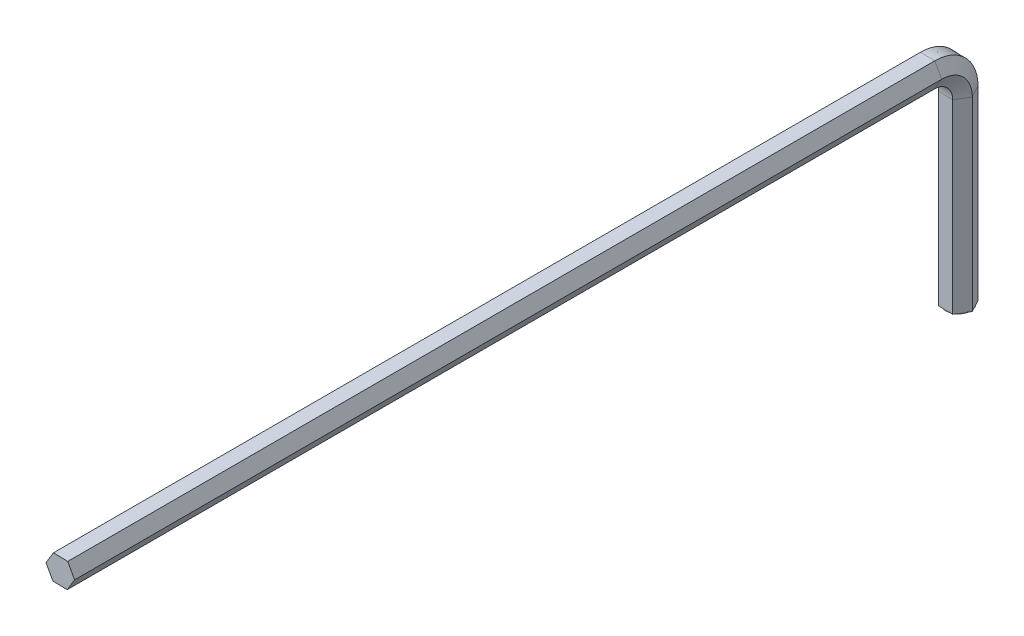
ISO-10303-21;
HEADER;
FILE_DESCRIPTION(('STEP AP214'),'2;1');
FILE_NAME('part.step','',(''),(''),'','','');
FILE_SCHEMA(('AUTOMOTIVE_DESIGN { 1 0 10303 214 1 1 1 1 }'));
ENDSEC;
DATA;
#1=APPLICATION_CONTEXT('core data for automotive mechanical design processes');
#2=APPLICATION_PROTOCOL_DEFINITION('international standard','automotive_design',2000,#1);
#3=PRODUCT_CONTEXT('',#1,'mechanical');
#4=PRODUCT('Part','Part','',(#3));
#5=PRODUCT_RELATED_PRODUCT_CATEGORY('part','',(#4));
#6=PRODUCT_DEFINITION_FORMATION('','',#4);
#7=PRODUCT_DEFINITION_CONTEXT('part definition',#1,'design');
#8=PRODUCT_DEFINITION('design','',#6,#7);
#9=PRODUCT_DEFINITION_SHAPE('','',#8);
#10=(LENGTH_UNIT() NAMED_UNIT(*) SI_UNIT(.MILLI.,.METRE.));
#11=(NAMED_UNIT(*) PLANE_ANGLE_UNIT() SI_UNIT($,.RADIAN.));
#12=(NAMED_UNIT(*) SI_UNIT($,.STERADIAN.) SOLID_ANGLE_UNIT());
#13=UNCERTAINTY_MEASURE_WITH_UNIT(LENGTH_MEASURE(1.E-05),#10,'distance_accuracy_value','');
#14=(GEOMETRIC_REPRESENTATION_CONTEXT(3) GLOBAL_UNCERTAINTY_ASSIGNED_CONTEXT((#13)) GLOBAL_UNIT_ASSIGNED_CONTEXT((#10,
#11,#12)) REPRESENTATION_CONTEXT('',''));
#15=CARTESIAN_POINT('',(0.,0.,0.));
#16=DIRECTION('',(0.,0.,1.));
#17=DIRECTION('',(1.,0.,0.));
#18=AXIS2_PLACEMENT_3D('',#15,#16,#17);
#19=CARTESIAN_POINT('',(0.,0.,0.));
#20=DIRECTION('',(0.,1.,0.));
#21=DIRECTION('',(0.,0.,1.));
#22=AXIS2_PLACEMENT_3D('',#19,#20,#21);
#23=PLANE('',#22);
#24=CARTESIAN_POINT('',(0.,0.,0.));
#25=DIRECTION('',(0.,-1.,0.));
#26=DIRECTION('',(0.,0.,-1.));
#27=AXIS2_PLACEMENT_3D('',#24,#25,#26);
#28=CIRCLE('',#27,2.);
#29=CARTESIAN_POINT('',(0.0427016764946208,0.,-1.9995440897426));
#30=VERTEX_POINT('',#29);
#31=CARTESIAN_POINT('',(1.75300681595143,0.,-0.962791308242771));
#32=VERTEX_POINT('',#31);
#33=EDGE_CURVE('E55',#30,#32,#28,.T.);
#34=ORIENTED_EDGE('',*,*,#33,.F.);
#35=DIRECTION('',(-0.999772044871298,0.,-0.0213508382473104));
#36=VECTOR('',#35,1.);
#37=CARTESIAN_POINT('',(1.19713899496403,0.,-1.97489026532358));
#38=LINE('',#37,#36);
#39=CARTESIAN_POINT('',(1.19713899496403,0.,-1.97489026532358));
#40=VERTEX_POINT('',#39);
#41=EDGE_CURVE('E152',#40,#30,#38,.T.);
#42=ORIENTED_EDGE('',*,*,#41,.F.);
#43=DIRECTION('',(-0.481395654121386,0.,-0.876503407975715));
#44=VECTOR('',#43,1.);
#45=CARTESIAN_POINT('',(2.30887463693882,0.,0.0493076488380349));
#46=LINE('',#45,#44);
#47=EDGE_CURVE('E178',#32,#40,#46,.T.);
#48=ORIENTED_EDGE('',*,*,#47,.F.);
#49=EDGE_LOOP('',(#34,#42,#48));
#50=FACE_BOUND('',#49,.T.);
#51=ADVANCED_FACE('F41',(#50),#23,.F.);
#52=CARTESIAN_POINT('',(1.71030513945681,0.,1.03675278149982));
#53=VERTEX_POINT('',#52);
#54=EDGE_CURVE('E11',#32,#53,#28,.T.);
#55=ORIENTED_EDGE('',*,*,#54,.F.);
#56=CARTESIAN_POINT('',(2.30887463693882,0.,0.0493076488380349));
#57=VERTEX_POINT('',#56);
#58=EDGE_CURVE('E171',#57,#32,#46,.T.);
#59=ORIENTED_EDGE('',*,*,#58,.F.);
#60=DIRECTION('',(0.518376390749912,0.,-0.855152569728405));
#61=VECTOR('',#60,1.);
#62=CARTESIAN_POINT('',(1.11173564197479,0.,2.02419791416162));
#63=LINE('',#62,#61);
#64=EDGE_CURVE('E238',#53,#57,#63,.T.);
#65=ORIENTED_EDGE('',*,*,#64,.F.);
#66=EDGE_LOOP('',(#55,#59,#65));
#67=FACE_BOUND('',#66,.T.);
#68=ADVANCED_FACE('F351',(#67),#23,.F.);
#69=CARTESIAN_POINT('',(-0.0427016764946206,0.,1.9995440897426));
#70=VERTEX_POINT('',#69);
#71=EDGE_CURVE('E49',#53,#70,#28,.T.);
#72=ORIENTED_EDGE('',*,*,#71,.F.);
#73=CARTESIAN_POINT('',(1.11173564197479,0.,2.02419791416162));
#74=VERTEX_POINT('',#73);
#75=EDGE_CURVE('E256',#74,#53,#63,.T.);
#76=ORIENTED_EDGE('',*,*,#75,.F.);
#77=DIRECTION('',(0.999772044871298,0.,0.0213508382473102));
#78=VECTOR('',#77,1.);
#79=CARTESIAN_POINT('',(-1.19713899496403,0.,1.97489026532358));
#80=LINE('',#79,#78);
#81=EDGE_CURVE('E218',#70,#74,#80,.T.);
#82=ORIENTED_EDGE('',*,*,#81,.F.);
#83=EDGE_LOOP('',(#72,#76,#82));
#84=FACE_BOUND('',#83,.T.);
#85=ADVANCED_FACE('F348',(#84),#23,.F.);
#86=CARTESIAN_POINT('',(-1.75300681595143,0.,0.962791308242776));
#87=VERTEX_POINT('',#86);
#88=EDGE_CURVE('E68',#70,#87,#28,.T.);
#89=ORIENTED_EDGE('',*,*,#88,.F.);
#90=CARTESIAN_POINT('',(-1.19713899496403,0.,1.97489026532358));
#91=VERTEX_POINT('',#90);
#92=EDGE_CURVE('E240',#91,#70,#80,.T.);
#93=ORIENTED_EDGE('',*,*,#92,.F.);
#94=DIRECTION('',(0.481395654121388,0.,0.876503407975714));
#95=VECTOR('',#94,1.);
#96=CARTESIAN_POINT('',(-2.30887463693883,0.,-0.0493076488380324));
#97=LINE('',#96,#95);
#98=EDGE_CURVE('E183',#87,#91,#97,.T.);
#99=ORIENTED_EDGE('',*,*,#98,.F.);
#100=EDGE_LOOP('',(#89,#93,#99));
#101=FACE_BOUND('',#100,.T.);
#102=ADVANCED_FACE('F377',(#101),#23,.F.);
#103=CARTESIAN_POINT('',(-1.71030513945681,0.,-1.03675278149982));
#104=VERTEX_POINT('',#103);
#105=EDGE_CURVE('E56',#87,#104,#28,.T.);
#106=ORIENTED_EDGE('',*,*,#105,.F.);
#107=CARTESIAN_POINT('',(-2.30887463693883,0.,-0.0493076488380324));
#108=VERTEX_POINT('',#107);
#109=EDGE_CURVE('E216',#108,#87,#97,.T.);
#110=ORIENTED_EDGE('',*,*,#109,.F.);
#111=DIRECTION('',(-0.518376390749912,0.,0.855152569728405));
#112=VECTOR('',#111,1.);
#113=CARTESIAN_POINT('',(-1.11173564197479,0.,-2.02419791416161));
#114=LINE('',#113,#112);
#115=EDGE_CURVE('E187',#104,#108,#114,.T.);
#116=ORIENTED_EDGE('',*,*,#115,.F.);
#117=EDGE_LOOP('',(#106,#110,#116));
#118=FACE_BOUND('',#117,.T.);
#119=ADVANCED_FACE('F373',(#118),#23,.F.);
#120=EDGE_CURVE('E168',#104,#30,#28,.T.);
#121=ORIENTED_EDGE('',*,*,#120,.F.);
#122=CARTESIAN_POINT('',(-1.11173564197479,0.,-2.02419791416161));
#123=VERTEX_POINT('',#122);
#124=EDGE_CURVE('E175',#123,#104,#114,.T.);
#125=ORIENTED_EDGE('',*,*,#124,.F.);
#126=EDGE_CURVE('E157',#30,#123,#38,.T.);
#127=ORIENTED_EDGE('',*,*,#126,.F.);
#128=EDGE_LOOP('',(#121,#125,#127));
#129=FACE_BOUND('',#128,.T.);
#130=ADVANCED_FACE('F43',(#129),#23,.F.);
#131=CARTESIAN_POINT('',(0.,35.,145.));
#132=DIRECTION('',(0.,0.,1.));
#133=DIRECTION('',(0.,-1.,0.));
#134=AXIS2_PLACEMENT_3D('',#131,#132,#133);
#135=PLANE('',#134);
#136=DIRECTION('',(-0.518376390749912,-0.855152569728405,0.));
#137=VECTOR('',#136,1.);
#138=CARTESIAN_POINT('',(-1.11173564197479,37.0241979141616,145.));
#139=LINE('',#138,#137);
#140=CARTESIAN_POINT('',(-1.11173564197479,37.0241979141616,145.));
#141=VERTEX_POINT('',#140);
#142=CARTESIAN_POINT('',(-2.30887463693883,35.049307648838,145.));
#143=VERTEX_POINT('',#142);
#144=EDGE_CURVE('E206',#141,#143,#139,.T.);
#145=ORIENTED_EDGE('',*,*,#144,.T.);
#146=DIRECTION('',(0.481395654121388,-0.876503407975714,0.));
#147=VECTOR('',#146,1.);
#148=CARTESIAN_POINT('',(-2.30887463693883,35.049307648838,145.));
#149=LINE('',#148,#147);
#150=CARTESIAN_POINT('',(-1.19713899496403,33.0251097346764,145.));
#151=VERTEX_POINT('',#150);
#152=EDGE_CURVE('E215',#143,#151,#149,.T.);
#153=ORIENTED_EDGE('',*,*,#152,.T.);
#154=DIRECTION('',(0.999772044871298,-0.0213508382473102,0.));
#155=VECTOR('',#154,1.);
#156=CARTESIAN_POINT('',(-1.19713899496403,33.0251097346764,145.));
#157=LINE('',#156,#155);
#158=CARTESIAN_POINT('',(1.11173564197479,32.9758020858384,145.));
#159=VERTEX_POINT('',#158);
#160=EDGE_CURVE('E237',#151,#159,#157,.T.);
#161=ORIENTED_EDGE('',*,*,#160,.T.);
#162=DIRECTION('',(0.518376390749912,0.855152569728405,0.));
#163=VECTOR('',#162,1.);
#164=CARTESIAN_POINT('',(1.11173564197479,32.9758020858384,145.));
#165=LINE('',#164,#163);
#166=CARTESIAN_POINT('',(2.30887463693882,34.950692351162,145.));
#167=VERTEX_POINT('',#166);
#168=EDGE_CURVE('E260',#159,#167,#165,.T.);
#169=ORIENTED_EDGE('',*,*,#168,.T.);
#170=DIRECTION('',(-0.481395654121386,0.876503407975715,0.));
#171=VECTOR('',#170,1.);
#172=CARTESIAN_POINT('',(2.30887463693882,34.950692351162,145.));
#173=LINE('',#172,#171);
#174=CARTESIAN_POINT('',(1.19713899496403,36.9748902653236,145.));
#175=VERTEX_POINT('',#174);
#176=EDGE_CURVE('E280',#167,#175,#173,.T.);
#177=ORIENTED_EDGE('',*,*,#176,.T.);
#178=DIRECTION('',(-0.999772044871298,0.0213508382473104,0.));
#179=VECTOR('',#178,1.);
#180=CARTESIAN_POINT('',(1.19713899496403,36.9748902653236,145.));
#181=LINE('',#180,#179);
#182=EDGE_CURVE('E44',#175,#141,#181,.T.);
#183=ORIENTED_EDGE('',*,*,#182,.T.);
#184=EDGE_LOOP('',(#145,#153,#161,#169,#177,#183));
#185=FACE_BOUND('',#184,.T.);
#186=ADVANCED_FACE('F317',(#185),#135,.T.);
#187=CARTESIAN_POINT('',(-1.11173564197479,0.,-2.02419791416161));
#188=DIRECTION('',(-0.855152569728405,0.,-0.518376390749912));
#189=DIRECTION('',(-0.518376390749912,0.,0.855152569728405));
#190=AXIS2_PLACEMENT_3D('',#187,#188,#189);
#191=PLANE('',#190);
#192=DIRECTION('',(0.,1.,0.));
#193=VECTOR('',#192,1.);
#194=CARTESIAN_POINT('',(-2.30887463693883,0.,-0.0493076488380324));
#195=LINE('',#194,#193);
#196=CARTESIAN_POINT('',(-2.30887463693883,30.,-0.0493076488380324));
#197=VERTEX_POINT('',#196);
#198=EDGE_CURVE('E188',#108,#197,#195,.T.);
#199=ORIENTED_EDGE('',*,*,#198,.T.);
#200=DIRECTION('',(-0.518376390749912,0.,0.855152569728405));
#201=VECTOR('',#200,1.);
#202=CARTESIAN_POINT('',(-1.11173564197479,30.,-2.02419791416161));
#203=LINE('',#202,#201);
#204=CARTESIAN_POINT('',(-1.11173564197479,30.,-2.02419791416161));
#205=VERTEX_POINT('',#204);
#206=EDGE_CURVE('E190',#205,#197,#203,.T.);
#207=ORIENTED_EDGE('',*,*,#206,.F.);
#208=DIRECTION('',(0.,1.,0.));
#209=VECTOR('',#208,1.);
#210=CARTESIAN_POINT('',(-1.11173564197479,0.,-2.02419791416161));
#211=LINE('',#210,#209);
#212=EDGE_CURVE('E167',#123,#205,#211,.T.);
#213=ORIENTED_EDGE('',*,*,#212,.F.);
#214=ORIENTED_EDGE('',*,*,#124,.T.);
#215=ORIENTED_EDGE('',*,*,#115,.T.);
#216=EDGE_LOOP('',(#199,#207,#213,#214,#215));
#217=FACE_BOUND('',#216,.T.);
#218=ADVANCED_FACE('F304',(#217),#191,.T.);
#219=CARTESIAN_POINT('',(-2.30887463693883,0.,-0.0493076488380324));
#220=DIRECTION('',(-0.876503407975714,0.,0.481395654121388));
#221=DIRECTION('',(0.481395654121388,0.,0.876503407975714));
#222=AXIS2_PLACEMENT_3D('',#219,#220,#221);
#223=PLANE('',#222);
#224=DIRECTION('',(0.,1.,0.));
#225=VECTOR('',#224,1.);
#226=CARTESIAN_POINT('',(-1.19713899496403,0.,1.97489026532358));
#227=LINE('',#226,#225);
#228=CARTESIAN_POINT('',(-1.19713899496403,30.,1.97489026532358));
#229=VERTEX_POINT('',#228);
#230=EDGE_CURVE('E225',#91,#229,#227,.T.);
#231=ORIENTED_EDGE('',*,*,#230,.T.);
#232=DIRECTION('',(0.481395654121388,0.,0.876503407975714));
#233=VECTOR('',#232,1.);
#234=CARTESIAN_POINT('',(-2.30887463693883,30.,-0.0493076488380324));
#235=LINE('',#234,#233);
#236=EDGE_CURVE('E191',#197,#229,#235,.T.);
#237=ORIENTED_EDGE('',*,*,#236,.F.);
#238=ORIENTED_EDGE('',*,*,#198,.F.);
#239=ORIENTED_EDGE('',*,*,#109,.T.);
#240=ORIENTED_EDGE('',*,*,#98,.T.);
#241=EDGE_LOOP('',(#231,#237,#238,#239,#240));
#242=FACE_BOUND('',#241,.T.);
#243=ADVANCED_FACE('F306',(#242),#223,.T.);
#244=CARTESIAN_POINT('',(-1.19713899496403,0.,1.97489026532358));
#245=DIRECTION('',(-0.0213508382473102,0.,0.999772044871298));
#246=DIRECTION('',(0.999772044871298,0.,0.0213508382473102));
#247=AXIS2_PLACEMENT_3D('',#244,#245,#246);
#248=PLANE('',#247);
#249=DIRECTION('',(0.,1.,0.));
#250=VECTOR('',#249,1.);
#251=CARTESIAN_POINT('',(1.11173564197479,0.,2.02419791416162));
#252=LINE('',#251,#250);
#253=CARTESIAN_POINT('',(1.11173564197479,30.,2.02419791416162));
#254=VERTEX_POINT('',#253);
#255=EDGE_CURVE('E244',#74,#254,#252,.T.);
#256=ORIENTED_EDGE('',*,*,#255,.T.);
#257=DIRECTION('',(0.999772044871298,0.,0.0213508382473102));
#258=VECTOR('',#257,1.);
#259=CARTESIAN_POINT('',(-1.19713899496403,30.,1.97489026532358));
#260=LINE('',#259,#258);
#261=EDGE_CURVE('E223',#229,#254,#260,.T.);
#262=ORIENTED_EDGE('',*,*,#261,.F.);
#263=ORIENTED_EDGE('',*,*,#230,.F.);
#264=ORIENTED_EDGE('',*,*,#92,.T.);
#265=ORIENTED_EDGE('',*,*,#81,.T.);
#266=EDGE_LOOP('',(#256,#262,#263,#264,#265));
#267=FACE_BOUND('',#266,.T.);
#268=ADVANCED_FACE('F347',(#267),#248,.T.);
#269=CARTESIAN_POINT('',(1.11173564197479,0.,2.02419791416162));
#270=DIRECTION('',(0.855152569728405,0.,0.518376390749912));
#271=DIRECTION('',(0.518376390749912,0.,-0.855152569728405));
#272=AXIS2_PLACEMENT_3D('',#269,#270,#271);
#273=PLANE('',#272);
#274=DIRECTION('',(0.,1.,0.));
#275=VECTOR('',#274,1.);
#276=CARTESIAN_POINT('',(2.30887463693882,0.,0.0493076488380349));
#277=LINE('',#276,#275);
#278=CARTESIAN_POINT('',(2.30887463693882,30.,0.0493076488380349));
#279=VERTEX_POINT('',#278);
#280=EDGE_CURVE('E263',#57,#279,#277,.T.);
#281=ORIENTED_EDGE('',*,*,#280,.T.);
#282=DIRECTION('',(0.518376390749912,0.,-0.855152569728405));
#283=VECTOR('',#282,1.);
#284=CARTESIAN_POINT('',(1.11173564197479,30.,2.02419791416162));
#285=LINE('',#284,#283);
#286=EDGE_CURVE('E248',#254,#279,#285,.T.);
#287=ORIENTED_EDGE('',*,*,#286,.F.);
#288=ORIENTED_EDGE('',*,*,#255,.F.);
#289=ORIENTED_EDGE('',*,*,#75,.T.);
#290=ORIENTED_EDGE('',*,*,#64,.T.);
#291=EDGE_LOOP('',(#281,#287,#288,#289,#290));
#292=FACE_BOUND('',#291,.T.);
#293=ADVANCED_FACE('F341',(#292),#273,.T.);
#294=CARTESIAN_POINT('',(2.30887463693882,0.,0.0493076488380349));
#295=DIRECTION('',(0.876503407975715,0.,-0.481395654121386));
#296=DIRECTION('',(-0.481395654121386,0.,-0.876503407975715));
#297=AXIS2_PLACEMENT_3D('',#294,#295,#296);
#298=PLANE('',#297);
#299=DIRECTION('',(0.,1.,0.));
#300=VECTOR('',#299,1.);
#301=CARTESIAN_POINT('',(1.19713899496403,0.,-1.97489026532358));
#302=LINE('',#301,#300);
#303=CARTESIAN_POINT('',(1.19713899496403,30.,-1.97489026532358));
#304=VERTEX_POINT('',#303);
#305=EDGE_CURVE('E165',#40,#304,#302,.T.);
#306=ORIENTED_EDGE('',*,*,#305,.T.);
#307=DIRECTION('',(-0.481395654121386,0.,-0.876503407975715));
#308=VECTOR('',#307,1.);
#309=CARTESIAN_POINT('',(2.30887463693882,30.,0.0493076488380349));
#310=LINE('',#309,#308);
#311=EDGE_CURVE('E266',#279,#304,#310,.T.);
#312=ORIENTED_EDGE('',*,*,#311,.F.);
#313=ORIENTED_EDGE('',*,*,#280,.F.);
#314=ORIENTED_EDGE('',*,*,#58,.T.);
#315=ORIENTED_EDGE('',*,*,#47,.T.);
#316=EDGE_LOOP('',(#306,#312,#313,#314,#315));
#317=FACE_BOUND('',#316,.T.);
#318=ADVANCED_FACE('F358',(#317),#298,.T.);
#319=CARTESIAN_POINT('',(1.19713899496403,0.,-1.97489026532358));
#320=DIRECTION('',(0.0213508382473104,0.,-0.999772044871298));
#321=DIRECTION('',(-0.999772044871298,0.,-0.0213508382473104));
#322=AXIS2_PLACEMENT_3D('',#319,#320,#321);
#323=PLANE('',#322);
#324=DIRECTION('',(-0.999772044871298,0.,-0.0213508382473104));
#325=VECTOR('',#324,1.);
#326=CARTESIAN_POINT('',(1.19713899496403,30.,-1.97489026532358));
#327=LINE('',#326,#325);
#328=EDGE_CURVE('E202',#304,#205,#327,.T.);
#329=ORIENTED_EDGE('',*,*,#328,.F.);
#330=ORIENTED_EDGE('',*,*,#305,.F.);
#331=ORIENTED_EDGE('',*,*,#41,.T.);
#332=ORIENTED_EDGE('',*,*,#126,.T.);
#333=ORIENTED_EDGE('',*,*,#212,.T.);
#334=EDGE_LOOP('',(#329,#330,#331,#332,#333));
#335=FACE_BOUND('',#334,.T.);
#336=ADVANCED_FACE('F160',(#335),#323,.T.);
#337=CARTESIAN_POINT('',(-1.11173564197479,30.,5.));
#338=DIRECTION('',(1.,0.,0.));
#339=DIRECTION('',(0.,0.,-1.));
#340=AXIS2_PLACEMENT_3D('',#337,#338,#339);
#341=CONICAL_SURFACE('',#340,7.02419791416161,1.02584509045698);
#342=CARTESIAN_POINT('',(-2.30887463693882,30.,5.));
#343=DIRECTION('',(1.,0.,0.));
#344=DIRECTION('',(0.,0.,-1.));
#345=AXIS2_PLACEMENT_3D('',#342,#343,#344);
#346=CIRCLE('',#345,5.04930764883803);
#347=CARTESIAN_POINT('',(-2.30887463693882,35.049307648838,5.));
#348=VERTEX_POINT('',#347);
#349=EDGE_CURVE('E196',#197,#348,#346,.T.);
#350=ORIENTED_EDGE('',*,*,#349,.T.);
#351=DIRECTION('',(-0.518376390749912,-0.855152569728405,0.));
#352=VECTOR('',#351,1.);
#353=CARTESIAN_POINT('',(-1.11173564197479,37.0241979141616,5.));
#354=LINE('',#353,#352);
#355=CARTESIAN_POINT('',(-1.11173564197479,37.0241979141616,5.));
#356=VERTEX_POINT('',#355);
#357=EDGE_CURVE('E192',#356,#348,#354,.T.);
#358=ORIENTED_EDGE('',*,*,#357,.F.);
#359=CARTESIAN_POINT('',(-1.11173564197479,30.,5.));
#360=DIRECTION('',(1.,0.,0.));
#361=DIRECTION('',(0.,0.,-1.));
#362=AXIS2_PLACEMENT_3D('',#359,#360,#361);
#363=CIRCLE('',#362,7.02419791416161);
#364=EDGE_CURVE('E200',#205,#356,#363,.T.);
#365=ORIENTED_EDGE('',*,*,#364,.F.);
#366=ORIENTED_EDGE('',*,*,#206,.T.);
#367=EDGE_LOOP('',(#350,#358,#365,#366));
#368=FACE_BOUND('',#367,.T.);
#369=ADVANCED_FACE('F296',(#368),#341,.T.);
#370=CARTESIAN_POINT('',(-2.30887463693882,30.,5.));
#371=DIRECTION('',(-1.,0.,0.));
#372=DIRECTION('',(0.,0.,1.));
#373=AXIS2_PLACEMENT_3D('',#370,#371,#372);
#374=CONICAL_SURFACE('',#373,5.04930764883803,1.06855001193621);
#375=CARTESIAN_POINT('',(-1.19713899496402,30.,5.));
#376=DIRECTION('',(1.,0.,0.));
#377=DIRECTION('',(0.,0.,-1.));
#378=AXIS2_PLACEMENT_3D('',#375,#376,#377);
#379=CIRCLE('',#378,3.02510973467642);
#380=CARTESIAN_POINT('',(-1.19713899496402,33.0251097346764,5.));
#381=VERTEX_POINT('',#380);
#382=EDGE_CURVE('E229',#229,#381,#379,.T.);
#383=ORIENTED_EDGE('',*,*,#382,.T.);
#384=DIRECTION('',(0.481395654121388,-0.876503407975714,0.));
#385=VECTOR('',#384,1.);
#386=CARTESIAN_POINT('',(-2.30887463693882,35.049307648838,5.));
#387=LINE('',#386,#385);
#388=EDGE_CURVE('E205',#348,#381,#387,.T.);
#389=ORIENTED_EDGE('',*,*,#388,.F.);
#390=ORIENTED_EDGE('',*,*,#349,.F.);
#391=ORIENTED_EDGE('',*,*,#236,.T.);
#392=EDGE_LOOP('',(#383,#389,#390,#391));
#393=FACE_BOUND('',#392,.T.);
#394=ADVANCED_FACE('F313',(#393),#374,.F.);
#395=CARTESIAN_POINT('',(-1.19713899496402,30.,5.));
#396=DIRECTION('',(-1.,0.,0.));
#397=DIRECTION('',(0.,0.,1.));
#398=AXIS2_PLACEMENT_3D('',#395,#396,#397);
#399=CONICAL_SURFACE('',#398,3.02510973467642,0.0213524607396136);
#400=CARTESIAN_POINT('',(1.11173564197479,30.,5.));
#401=DIRECTION('',(1.,0.,0.));
#402=DIRECTION('',(0.,0.,-1.));
#403=AXIS2_PLACEMENT_3D('',#400,#401,#402);
#404=CIRCLE('',#403,2.97580208583838);
#405=CARTESIAN_POINT('',(1.11173564197479,32.9758020858384,5.));
#406=VERTEX_POINT('',#405);
#407=EDGE_CURVE('E249',#254,#406,#404,.T.);
#408=ORIENTED_EDGE('',*,*,#407,.T.);
#409=DIRECTION('',(0.999772044871298,-0.0213508382473102,0.));
#410=VECTOR('',#409,1.);
#411=CARTESIAN_POINT('',(-1.19713899496402,33.0251097346764,5.));
#412=LINE('',#411,#410);
#413=EDGE_CURVE('E233',#381,#406,#412,.T.);
#414=ORIENTED_EDGE('',*,*,#413,.F.);
#415=ORIENTED_EDGE('',*,*,#382,.F.);
#416=ORIENTED_EDGE('',*,*,#261,.T.);
#417=EDGE_LOOP('',(#408,#414,#415,#416));
#418=FACE_BOUND('',#417,.T.);
#419=ADVANCED_FACE('F336',(#418),#399,.F.);
#420=CARTESIAN_POINT('',(1.11173564197479,30.,5.));
#421=DIRECTION('',(1.,0.,0.));
#422=DIRECTION('',(0.,0.,-1.));
#423=AXIS2_PLACEMENT_3D('',#420,#421,#422);
#424=CONICAL_SURFACE('',#423,2.97580208583838,1.02584509045698);
#425=CARTESIAN_POINT('',(2.30887463693883,30.,5.));
#426=DIRECTION('',(1.,0.,0.));
#427=DIRECTION('',(0.,0.,-1.));
#428=AXIS2_PLACEMENT_3D('',#425,#426,#427);
#429=CIRCLE('',#428,4.95069235116197);
#430=CARTESIAN_POINT('',(2.30887463693883,34.950692351162,5.));
#431=VERTEX_POINT('',#430);
#432=EDGE_CURVE('E267',#279,#431,#429,.T.);
#433=ORIENTED_EDGE('',*,*,#432,.T.);
#434=DIRECTION('',(0.518376390749912,0.855152569728405,0.));
#435=VECTOR('',#434,1.);
#436=CARTESIAN_POINT('',(1.11173564197479,32.9758020858384,5.));
#437=LINE('',#436,#435);
#438=EDGE_CURVE('E252',#406,#431,#437,.T.);
#439=ORIENTED_EDGE('',*,*,#438,.F.);
#440=ORIENTED_EDGE('',*,*,#407,.F.);
#441=ORIENTED_EDGE('',*,*,#286,.T.);
#442=EDGE_LOOP('',(#433,#439,#440,#441));
#443=FACE_BOUND('',#442,.T.);
#444=ADVANCED_FACE('F329',(#443),#424,.F.);
#445=CARTESIAN_POINT('',(2.30887463693883,30.,5.));
#446=DIRECTION('',(-1.,0.,0.));
#447=DIRECTION('',(0.,0.,1.));
#448=AXIS2_PLACEMENT_3D('',#445,#446,#447);
#449=CONICAL_SURFACE('',#448,4.95069235116197,1.06855001193621);
#450=CARTESIAN_POINT('',(1.19713899496404,30.,5.));
#451=DIRECTION('',(1.,0.,0.));
#452=DIRECTION('',(0.,0.,-1.));
#453=AXIS2_PLACEMENT_3D('',#450,#451,#452);
#454=CIRCLE('',#453,6.97489026532358);
#455=CARTESIAN_POINT('',(1.19713899496404,36.9748902653236,5.));
#456=VERTEX_POINT('',#455);
#457=EDGE_CURVE('E281',#304,#456,#454,.T.);
#458=ORIENTED_EDGE('',*,*,#457,.T.);
#459=DIRECTION('',(-0.481395654121386,0.876503407975715,0.));
#460=VECTOR('',#459,1.);
#461=CARTESIAN_POINT('',(2.30887463693883,34.950692351162,5.));
#462=LINE('',#461,#460);
#463=EDGE_CURVE('E275',#431,#456,#462,.T.);
#464=ORIENTED_EDGE('',*,*,#463,.F.);
#465=ORIENTED_EDGE('',*,*,#432,.F.);
#466=ORIENTED_EDGE('',*,*,#311,.T.);
#467=EDGE_LOOP('',(#458,#464,#465,#466));
#468=FACE_BOUND('',#467,.T.);
#469=ADVANCED_FACE('F326',(#468),#449,.T.);
#470=CARTESIAN_POINT('',(1.19713899496404,30.,5.));
#471=DIRECTION('',(-1.,0.,0.));
#472=DIRECTION('',(0.,0.,1.));
#473=AXIS2_PLACEMENT_3D('',#470,#471,#472);
#474=CONICAL_SURFACE('',#473,6.97489026532358,0.0213524607396139);
#475=DIRECTION('',(-0.999772044871298,0.0213508382473104,0.));
#476=VECTOR('',#475,1.);
#477=CARTESIAN_POINT('',(1.19713899496404,36.9748902653236,5.));
#478=LINE('',#477,#476);
#479=EDGE_CURVE('E214',#456,#356,#478,.T.);
#480=ORIENTED_EDGE('',*,*,#479,.F.);
#481=ORIENTED_EDGE('',*,*,#457,.F.);
#482=ORIENTED_EDGE('',*,*,#328,.T.);
#483=ORIENTED_EDGE('',*,*,#364,.T.);
#484=EDGE_LOOP('',(#480,#481,#482,#483));
#485=FACE_BOUND('',#484,.T.);
#486=ADVANCED_FACE('F303',(#485),#474,.T.);
#487=CARTESIAN_POINT('',(-1.11173564197479,37.0241979141616,5.));
#488=DIRECTION('',(-0.855152569728405,0.518376390749912,0.));
#489=DIRECTION('',(-0.518376390749912,-0.855152569728405,0.));
#490=AXIS2_PLACEMENT_3D('',#487,#488,#489);
#491=PLANE('',#490);
#492=DIRECTION('',(0.,0.,1.));
#493=VECTOR('',#492,1.);
#494=CARTESIAN_POINT('',(-2.30887463693883,35.049307648838,5.));
#495=LINE('',#494,#493);
#496=EDGE_CURVE('E208',#348,#143,#495,.T.);
#497=ORIENTED_EDGE('',*,*,#496,.T.);
#498=ORIENTED_EDGE('',*,*,#144,.F.);
#499=DIRECTION('',(0.,0.,1.));
#500=VECTOR('',#499,1.);
#501=CARTESIAN_POINT('',(-1.11173564197479,37.0241979141616,5.));
#502=LINE('',#501,#500);
#503=EDGE_CURVE('E207',#356,#141,#502,.T.);
#504=ORIENTED_EDGE('',*,*,#503,.F.);
#505=ORIENTED_EDGE('',*,*,#357,.T.);
#506=EDGE_LOOP('',(#497,#498,#504,#505));
#507=FACE_BOUND('',#506,.T.);
#508=ADVANCED_FACE('F320',(#507),#491,.T.);
#509=CARTESIAN_POINT('',(-2.30887463693883,35.049307648838,5.));
#510=DIRECTION('',(-0.876503407975714,-0.481395654121388,0.));
#511=DIRECTION('',(0.481395654121388,-0.876503407975714,0.));
#512=AXIS2_PLACEMENT_3D('',#509,#510,#511);
#513=PLANE('',#512);
#514=DIRECTION('',(0.,0.,1.));
#515=VECTOR('',#514,1.);
#516=CARTESIAN_POINT('',(-1.19713899496403,33.0251097346764,5.));
#517=LINE('',#516,#515);
#518=EDGE_CURVE('E231',#381,#151,#517,.T.);
#519=ORIENTED_EDGE('',*,*,#518,.T.);
#520=ORIENTED_EDGE('',*,*,#152,.F.);
#521=ORIENTED_EDGE('',*,*,#496,.F.);
#522=ORIENTED_EDGE('',*,*,#388,.T.);
#523=EDGE_LOOP('',(#519,#520,#521,#522));
#524=FACE_BOUND('',#523,.T.);
#525=ADVANCED_FACE('F314',(#524),#513,.T.);
#526=CARTESIAN_POINT('',(-1.19713899496403,33.0251097346764,5.));
#527=DIRECTION('',(-0.0213508382473102,-0.999772044871298,0.));
#528=DIRECTION('',(0.999772044871298,-0.0213508382473102,0.));
#529=AXIS2_PLACEMENT_3D('',#526,#527,#528);
#530=PLANE('',#529);
#531=DIRECTION('',(0.,0.,1.));
#532=VECTOR('',#531,1.);
#533=CARTESIAN_POINT('',(1.11173564197479,32.9758020858384,5.));
#534=LINE('',#533,#532);
#535=EDGE_CURVE('E255',#406,#159,#534,.T.);
#536=ORIENTED_EDGE('',*,*,#535,.T.);
#537=ORIENTED_EDGE('',*,*,#160,.F.);
#538=ORIENTED_EDGE('',*,*,#518,.F.);
#539=ORIENTED_EDGE('',*,*,#413,.T.);
#540=EDGE_LOOP('',(#536,#537,#538,#539));
#541=FACE_BOUND('',#540,.T.);
#542=ADVANCED_FACE('F337',(#541),#530,.T.);
#543=CARTESIAN_POINT('',(1.11173564197479,32.9758020858384,5.));
#544=DIRECTION('',(0.855152569728405,-0.518376390749912,0.));
#545=DIRECTION('',(0.518376390749912,0.855152569728405,0.));
#546=AXIS2_PLACEMENT_3D('',#543,#544,#545);
#547=PLANE('',#546);
#548=DIRECTION('',(0.,0.,1.));
#549=VECTOR('',#548,1.);
#550=CARTESIAN_POINT('',(2.30887463693882,34.950692351162,5.));
#551=LINE('',#550,#549);
#552=EDGE_CURVE('E273',#431,#167,#551,.T.);
#553=ORIENTED_EDGE('',*,*,#552,.T.);
#554=ORIENTED_EDGE('',*,*,#168,.F.);
#555=ORIENTED_EDGE('',*,*,#535,.F.);
#556=ORIENTED_EDGE('',*,*,#438,.T.);
#557=EDGE_LOOP('',(#553,#554,#555,#556));
#558=FACE_BOUND('',#557,.T.);
#559=ADVANCED_FACE('F334',(#558),#547,.T.);
#560=CARTESIAN_POINT('',(2.30887463693882,34.950692351162,5.));
#561=DIRECTION('',(0.876503407975715,0.481395654121386,0.));
#562=DIRECTION('',(-0.481395654121386,0.876503407975715,0.));
#563=AXIS2_PLACEMENT_3D('',#560,#561,#562);
#564=PLANE('',#563);
#565=DIRECTION('',(0.,0.,1.));
#566=VECTOR('',#565,1.);
#567=CARTESIAN_POINT('',(1.19713899496403,36.9748902653236,5.));
#568=LINE('',#567,#566);
#569=EDGE_CURVE('E182',#456,#175,#568,.T.);
#570=ORIENTED_EDGE('',*,*,#569,.T.);
#571=ORIENTED_EDGE('',*,*,#176,.F.);
#572=ORIENTED_EDGE('',*,*,#552,.F.);
#573=ORIENTED_EDGE('',*,*,#463,.T.);
#574=EDGE_LOOP('',(#570,#571,#572,#573));
#575=FACE_BOUND('',#574,.T.);
#576=ADVANCED_FACE('F323',(#575),#564,.T.);
#577=CARTESIAN_POINT('',(1.19713899496403,36.9748902653236,5.));
#578=DIRECTION('',(0.0213508382473103,0.999772044871298,0.));
#579=DIRECTION('',(-0.999772044871298,0.0213508382473104,0.));
#580=AXIS2_PLACEMENT_3D('',#577,#578,#579);
#581=PLANE('',#580);
#582=ORIENTED_EDGE('',*,*,#182,.F.);
#583=ORIENTED_EDGE('',*,*,#569,.F.);
#584=ORIENTED_EDGE('',*,*,#479,.T.);
#585=ORIENTED_EDGE('',*,*,#503,.T.);
#586=EDGE_LOOP('',(#582,#583,#584,#585));
#587=FACE_BOUND('',#586,.T.);
#588=ADVANCED_FACE('F297',(#587),#581,.T.);
#589=CARTESIAN_POINT('',(0.,-0.1,0.));
#590=DIRECTION('',(0.,1.,0.));
#591=DIRECTION('',(0.,0.,1.));
#592=AXIS2_PLACEMENT_3D('',#589,#590,#591);
#593=CYLINDRICAL_SURFACE('',#592,2.);
#594=CARTESIAN_POINT('',(0.,-0.1,0.));
#595=DIRECTION('',(0.,-1.,0.));
#596=DIRECTION('',(0.,0.,-1.));
#597=AXIS2_PLACEMENT_3D('',#594,#595,#596);
#598=CIRCLE('',#597,2.);
#599=CARTESIAN_POINT('',(0.,-0.1,-2.));
#600=VERTEX_POINT('',#599);
#601=EDGE_CURVE('E179',#600,#600,#598,.T.);
#602=ORIENTED_EDGE('',*,*,#601,.F.);
#603=EDGE_LOOP('',(#602));
#604=FACE_BOUND('',#603,.T.);
#605=ORIENTED_EDGE('',*,*,#33,.T.);
#606=ORIENTED_EDGE('',*,*,#54,.T.);
#607=ORIENTED_EDGE('',*,*,#71,.T.);
#608=ORIENTED_EDGE('',*,*,#88,.T.);
#609=ORIENTED_EDGE('',*,*,#105,.T.);
#610=ORIENTED_EDGE('',*,*,#120,.T.);
#611=EDGE_LOOP('',(#605,#606,#607,#608,#609,#610));
#612=FACE_BOUND('',#611,.T.);
#613=ADVANCED_FACE('F177',(#604,#612),#593,.T.);
#614=CARTESIAN_POINT('',(0.,-0.1,0.));
#615=DIRECTION('',(0.,-1.,0.));
#616=DIRECTION('',(0.,0.,-1.));
#617=AXIS2_PLACEMENT_3D('',#614,#615,#616);
#618=PLANE('',#617);
#619=ORIENTED_EDGE('',*,*,#601,.T.);
#620=EDGE_LOOP('',(#619));
#621=FACE_BOUND('',#620,.T.);
#622=ADVANCED_FACE('F381',(#621),#618,.T.);
#623=CLOSED_SHELL('',(#51,#68,#85,#102,#119,#130,#186,#218,#243,#268,#293,#318,#336,#369,#394,
#419,#444,#469,#486,#508,#525,#542,#559,#576,#588,#613,#622));
#624=MANIFOLD_SOLID_BREP('B2',#623);
#625=ADVANCED_BREP_SHAPE_REPRESENTATION('',(#18,#624),#14);
#626=SHAPE_DEFINITION_REPRESENTATION(#9,#625);
ENDSEC;
END-ISO-10303-21;
